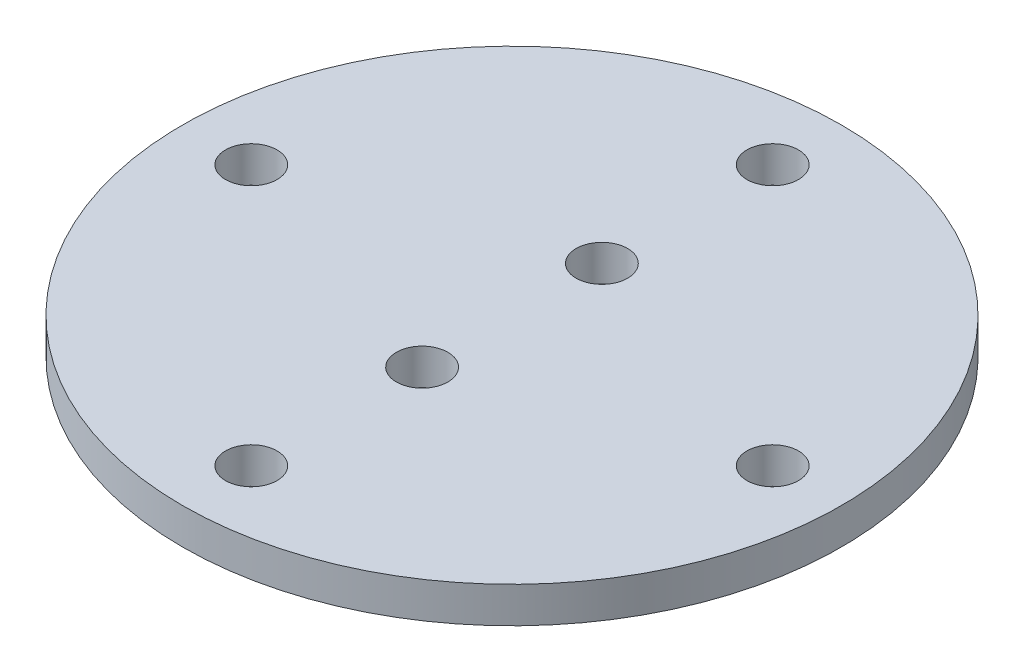
ISO-10303-21;
HEADER;
FILE_DESCRIPTION(('STEP AP214'),'2;1');
FILE_NAME('part.step','',(''),(''),'','','');
FILE_SCHEMA(('AUTOMOTIVE_DESIGN { 1 0 10303 214 1 1 1 1 }'));
ENDSEC;
DATA;
#1=APPLICATION_CONTEXT('core data for automotive mechanical design processes');
#2=APPLICATION_PROTOCOL_DEFINITION('international standard','automotive_design',2000,#1);
#3=PRODUCT_CONTEXT('',#1,'mechanical');
#4=PRODUCT('Part','Part','',(#3));
#5=PRODUCT_RELATED_PRODUCT_CATEGORY('part','',(#4));
#6=PRODUCT_DEFINITION_FORMATION('','',#4);
#7=PRODUCT_DEFINITION_CONTEXT('part definition',#1,'design');
#8=PRODUCT_DEFINITION('design','',#6,#7);
#9=PRODUCT_DEFINITION_SHAPE('','',#8);
#10=(LENGTH_UNIT() NAMED_UNIT(*) SI_UNIT(.MILLI.,.METRE.));
#11=(NAMED_UNIT(*) PLANE_ANGLE_UNIT() SI_UNIT($,.RADIAN.));
#12=(NAMED_UNIT(*) SI_UNIT($,.STERADIAN.) SOLID_ANGLE_UNIT());
#13=UNCERTAINTY_MEASURE_WITH_UNIT(LENGTH_MEASURE(1.E-05),#10,'distance_accuracy_value','');
#14=(GEOMETRIC_REPRESENTATION_CONTEXT(3) GLOBAL_UNCERTAINTY_ASSIGNED_CONTEXT((#13)) GLOBAL_UNIT_ASSIGNED_CONTEXT((#10,
#11,#12)) REPRESENTATION_CONTEXT('',''));
#15=CARTESIAN_POINT('',(0.,0.,0.));
#16=DIRECTION('',(0.,0.,1.));
#17=DIRECTION('',(1.,0.,0.));
#18=AXIS2_PLACEMENT_3D('',#15,#16,#17);
#19=CARTESIAN_POINT('',(0.,3.,0.));
#20=DIRECTION('',(0.,1.,0.));
#21=DIRECTION('',(0.,0.,1.));
#22=AXIS2_PLACEMENT_3D('',#19,#20,#21);
#23=PLANE('',#22);
#24=CARTESIAN_POINT('',(0.,3.,-7.5));
#25=DIRECTION('',(0.,1.,0.));
#26=DIRECTION('',(0.,0.,1.));
#27=AXIS2_PLACEMENT_3D('',#24,#25,#26);
#28=CIRCLE('',#27,2.15);
#29=CARTESIAN_POINT('',(0.,3.,-5.35));
#30=VERTEX_POINT('',#29);
#31=EDGE_CURVE('E73',#30,#30,#28,.T.);
#32=ORIENTED_EDGE('',*,*,#31,.F.);
#33=EDGE_LOOP('',(#32));
#34=FACE_BOUND('',#33,.T.);
#35=CARTESIAN_POINT('',(0.,3.,-21.7548503515756));
#36=DIRECTION('',(0.,1.,0.));
#37=DIRECTION('',(0.,0.,1.));
#38=AXIS2_PLACEMENT_3D('',#35,#36,#37);
#39=CIRCLE('',#38,2.15);
#40=CARTESIAN_POINT('',(0.,3.,-19.6048503515756));
#41=VERTEX_POINT('',#40);
#42=EDGE_CURVE('E61',#41,#41,#39,.T.);
#43=ORIENTED_EDGE('',*,*,#42,.F.);
#44=EDGE_LOOP('',(#43));
#45=FACE_BOUND('',#44,.T.);
#46=CARTESIAN_POINT('',(0.,3.,21.7548503515756));
#47=DIRECTION('',(0.,1.,0.));
#48=DIRECTION('',(0.,0.,1.));
#49=AXIS2_PLACEMENT_3D('',#46,#47,#48);
#50=CIRCLE('',#49,2.15);
#51=CARTESIAN_POINT('',(0.,3.,23.9048503515756));
#52=VERTEX_POINT('',#51);
#53=EDGE_CURVE('E50',#52,#52,#50,.T.);
#54=ORIENTED_EDGE('',*,*,#53,.F.);
#55=EDGE_LOOP('',(#54));
#56=FACE_BOUND('',#55,.T.);
#57=CARTESIAN_POINT('',(0.,3.,0.));
#58=DIRECTION('',(0.,1.,0.));
#59=DIRECTION('',(0.,0.,1.));
#60=AXIS2_PLACEMENT_3D('',#57,#58,#59);
#61=CIRCLE('',#60,27.5);
#62=CARTESIAN_POINT('',(0.,3.,27.5));
#63=VERTEX_POINT('',#62);
#64=EDGE_CURVE('E10',#63,#63,#61,.T.);
#65=ORIENTED_EDGE('',*,*,#64,.T.);
#66=EDGE_LOOP('',(#65));
#67=FACE_BOUND('',#66,.T.);
#68=CARTESIAN_POINT('',(21.7548503515756,3.,0.));
#69=DIRECTION('',(0.,1.,0.));
#70=DIRECTION('',(0.,0.,1.));
#71=AXIS2_PLACEMENT_3D('',#68,#69,#70);
#72=CIRCLE('',#71,2.15);
#73=CARTESIAN_POINT('',(21.7548503515756,3.,2.15));
#74=VERTEX_POINT('',#73);
#75=EDGE_CURVE('E55',#74,#74,#72,.T.);
#76=ORIENTED_EDGE('',*,*,#75,.F.);
#77=EDGE_LOOP('',(#76));
#78=FACE_BOUND('',#77,.T.);
#79=CARTESIAN_POINT('',(-21.7548503515756,3.,0.));
#80=DIRECTION('',(0.,1.,0.));
#81=DIRECTION('',(0.,0.,1.));
#82=AXIS2_PLACEMENT_3D('',#79,#80,#81);
#83=CIRCLE('',#82,2.15);
#84=CARTESIAN_POINT('',(-21.7548503515756,3.,2.15));
#85=VERTEX_POINT('',#84);
#86=EDGE_CURVE('E67',#85,#85,#83,.T.);
#87=ORIENTED_EDGE('',*,*,#86,.F.);
#88=EDGE_LOOP('',(#87));
#89=FACE_BOUND('',#88,.T.);
#90=CARTESIAN_POINT('',(0.,3.,7.5));
#91=DIRECTION('',(0.,1.,0.));
#92=DIRECTION('',(0.,0.,1.));
#93=AXIS2_PLACEMENT_3D('',#90,#91,#92);
#94=CIRCLE('',#93,2.15);
#95=CARTESIAN_POINT('',(0.,3.,9.65));
#96=VERTEX_POINT('',#95);
#97=EDGE_CURVE('E79',#96,#96,#94,.T.);
#98=ORIENTED_EDGE('',*,*,#97,.F.);
#99=EDGE_LOOP('',(#98));
#100=FACE_BOUND('',#99,.T.);
#101=ADVANCED_FACE('F39',(#34,#45,#56,#67,#78,#89,#100),#23,.T.);
#102=CARTESIAN_POINT('',(0.,0.,0.));
#103=DIRECTION('',(0.,1.,0.));
#104=DIRECTION('',(0.,0.,1.));
#105=AXIS2_PLACEMENT_3D('',#102,#103,#104);
#106=PLANE('',#105);
#107=CARTESIAN_POINT('',(0.,0.,0.));
#108=DIRECTION('',(0.,1.,0.));
#109=DIRECTION('',(0.,0.,1.));
#110=AXIS2_PLACEMENT_3D('',#107,#108,#109);
#111=CIRCLE('',#110,27.5);
#112=CARTESIAN_POINT('',(0.,0.,27.5));
#113=VERTEX_POINT('',#112);
#114=EDGE_CURVE('E43',#113,#113,#111,.T.);
#115=ORIENTED_EDGE('',*,*,#114,.F.);
#116=EDGE_LOOP('',(#115));
#117=FACE_BOUND('',#116,.T.);
#118=CARTESIAN_POINT('',(0.,0.,21.7548503515756));
#119=DIRECTION('',(0.,1.,0.));
#120=DIRECTION('',(0.,0.,1.));
#121=AXIS2_PLACEMENT_3D('',#118,#119,#120);
#122=CIRCLE('',#121,2.15);
#123=CARTESIAN_POINT('',(0.,0.,23.9048503515756));
#124=VERTEX_POINT('',#123);
#125=EDGE_CURVE('E52',#124,#124,#122,.T.);
#126=ORIENTED_EDGE('',*,*,#125,.T.);
#127=EDGE_LOOP('',(#126));
#128=FACE_BOUND('',#127,.T.);
#129=CARTESIAN_POINT('',(21.7548503515756,0.,0.));
#130=DIRECTION('',(0.,1.,0.));
#131=DIRECTION('',(0.,0.,1.));
#132=AXIS2_PLACEMENT_3D('',#129,#130,#131);
#133=CIRCLE('',#132,2.15);
#134=CARTESIAN_POINT('',(21.7548503515756,0.,2.15));
#135=VERTEX_POINT('',#134);
#136=EDGE_CURVE('E58',#135,#135,#133,.T.);
#137=ORIENTED_EDGE('',*,*,#136,.T.);
#138=EDGE_LOOP('',(#137));
#139=FACE_BOUND('',#138,.T.);
#140=CARTESIAN_POINT('',(0.,0.,-21.7548503515756));
#141=DIRECTION('',(0.,1.,0.));
#142=DIRECTION('',(0.,0.,1.));
#143=AXIS2_PLACEMENT_3D('',#140,#141,#142);
#144=CIRCLE('',#143,2.15);
#145=CARTESIAN_POINT('',(0.,0.,-19.6048503515756));
#146=VERTEX_POINT('',#145);
#147=EDGE_CURVE('E64',#146,#146,#144,.T.);
#148=ORIENTED_EDGE('',*,*,#147,.T.);
#149=EDGE_LOOP('',(#148));
#150=FACE_BOUND('',#149,.T.);
#151=CARTESIAN_POINT('',(-21.7548503515756,0.,0.));
#152=DIRECTION('',(0.,1.,0.));
#153=DIRECTION('',(0.,0.,1.));
#154=AXIS2_PLACEMENT_3D('',#151,#152,#153);
#155=CIRCLE('',#154,2.15);
#156=CARTESIAN_POINT('',(-21.7548503515756,0.,2.15));
#157=VERTEX_POINT('',#156);
#158=EDGE_CURVE('E70',#157,#157,#155,.T.);
#159=ORIENTED_EDGE('',*,*,#158,.T.);
#160=EDGE_LOOP('',(#159));
#161=FACE_BOUND('',#160,.T.);
#162=CARTESIAN_POINT('',(0.,0.,-7.5));
#163=DIRECTION('',(0.,1.,0.));
#164=DIRECTION('',(0.,0.,1.));
#165=AXIS2_PLACEMENT_3D('',#162,#163,#164);
#166=CIRCLE('',#165,2.15);
#167=CARTESIAN_POINT('',(0.,0.,-5.35));
#168=VERTEX_POINT('',#167);
#169=EDGE_CURVE('E76',#168,#168,#166,.T.);
#170=ORIENTED_EDGE('',*,*,#169,.T.);
#171=EDGE_LOOP('',(#170));
#172=FACE_BOUND('',#171,.T.);
#173=CARTESIAN_POINT('',(0.,0.,7.5));
#174=DIRECTION('',(0.,1.,0.));
#175=DIRECTION('',(0.,0.,1.));
#176=AXIS2_PLACEMENT_3D('',#173,#174,#175);
#177=CIRCLE('',#176,2.15);
#178=CARTESIAN_POINT('',(0.,0.,9.65));
#179=VERTEX_POINT('',#178);
#180=EDGE_CURVE('E82',#179,#179,#177,.T.);
#181=ORIENTED_EDGE('',*,*,#180,.T.);
#182=EDGE_LOOP('',(#181));
#183=FACE_BOUND('',#182,.T.);
#184=ADVANCED_FACE('F92',(#117,#128,#139,#150,#161,#172,#183),#106,.F.);
#185=CARTESIAN_POINT('',(0.,3.,0.));
#186=DIRECTION('',(0.,-1.,0.));
#187=DIRECTION('',(0.,0.,-1.));
#188=AXIS2_PLACEMENT_3D('',#185,#186,#187);
#189=CYLINDRICAL_SURFACE('',#188,27.5);
#190=ORIENTED_EDGE('',*,*,#64,.F.);
#191=EDGE_LOOP('',(#190));
#192=FACE_BOUND('',#191,.T.);
#193=ORIENTED_EDGE('',*,*,#114,.T.);
#194=EDGE_LOOP('',(#193));
#195=FACE_BOUND('',#194,.T.);
#196=ADVANCED_FACE('F41',(#192,#195),#189,.T.);
#197=CARTESIAN_POINT('',(0.,3.,21.7548503515756));
#198=DIRECTION('',(0.,-1.,0.));
#199=DIRECTION('',(0.,0.,-1.));
#200=AXIS2_PLACEMENT_3D('',#197,#198,#199);
#201=CYLINDRICAL_SURFACE('',#200,2.15);
#202=ORIENTED_EDGE('',*,*,#53,.T.);
#203=EDGE_LOOP('',(#202));
#204=FACE_BOUND('',#203,.T.);
#205=ORIENTED_EDGE('',*,*,#125,.F.);
#206=EDGE_LOOP('',(#205));
#207=FACE_BOUND('',#206,.T.);
#208=ADVANCED_FACE('F102',(#204,#207),#201,.F.);
#209=CARTESIAN_POINT('',(21.7548503515756,3.,0.));
#210=DIRECTION('',(0.,-1.,0.));
#211=DIRECTION('',(0.,0.,-1.));
#212=AXIS2_PLACEMENT_3D('',#209,#210,#211);
#213=CYLINDRICAL_SURFACE('',#212,2.15);
#214=ORIENTED_EDGE('',*,*,#75,.T.);
#215=EDGE_LOOP('',(#214));
#216=FACE_BOUND('',#215,.T.);
#217=ORIENTED_EDGE('',*,*,#136,.F.);
#218=EDGE_LOOP('',(#217));
#219=FACE_BOUND('',#218,.T.);
#220=ADVANCED_FACE('F105',(#216,#219),#213,.F.);
#221=CARTESIAN_POINT('',(0.,3.,-21.7548503515756));
#222=DIRECTION('',(0.,-1.,0.));
#223=DIRECTION('',(0.,0.,-1.));
#224=AXIS2_PLACEMENT_3D('',#221,#222,#223);
#225=CYLINDRICAL_SURFACE('',#224,2.15);
#226=ORIENTED_EDGE('',*,*,#42,.T.);
#227=EDGE_LOOP('',(#226));
#228=FACE_BOUND('',#227,.T.);
#229=ORIENTED_EDGE('',*,*,#147,.F.);
#230=EDGE_LOOP('',(#229));
#231=FACE_BOUND('',#230,.T.);
#232=ADVANCED_FACE('F109',(#228,#231),#225,.F.);
#233=CARTESIAN_POINT('',(-21.7548503515756,3.,0.));
#234=DIRECTION('',(0.,-1.,0.));
#235=DIRECTION('',(0.,0.,-1.));
#236=AXIS2_PLACEMENT_3D('',#233,#234,#235);
#237=CYLINDRICAL_SURFACE('',#236,2.15);
#238=ORIENTED_EDGE('',*,*,#86,.T.);
#239=EDGE_LOOP('',(#238));
#240=FACE_BOUND('',#239,.T.);
#241=ORIENTED_EDGE('',*,*,#158,.F.);
#242=EDGE_LOOP('',(#241));
#243=FACE_BOUND('',#242,.T.);
#244=ADVANCED_FACE('F113',(#240,#243),#237,.F.);
#245=CARTESIAN_POINT('',(0.,3.,-7.5));
#246=DIRECTION('',(0.,-1.,0.));
#247=DIRECTION('',(0.,0.,-1.));
#248=AXIS2_PLACEMENT_3D('',#245,#246,#247);
#249=CYLINDRICAL_SURFACE('',#248,2.15);
#250=ORIENTED_EDGE('',*,*,#31,.T.);
#251=EDGE_LOOP('',(#250));
#252=FACE_BOUND('',#251,.T.);
#253=ORIENTED_EDGE('',*,*,#169,.F.);
#254=EDGE_LOOP('',(#253));
#255=FACE_BOUND('',#254,.T.);
#256=ADVANCED_FACE('F117',(#252,#255),#249,.F.);
#257=CARTESIAN_POINT('',(0.,3.,7.5));
#258=DIRECTION('',(0.,-1.,0.));
#259=DIRECTION('',(0.,0.,-1.));
#260=AXIS2_PLACEMENT_3D('',#257,#258,#259);
#261=CYLINDRICAL_SURFACE('',#260,2.15);
#262=ORIENTED_EDGE('',*,*,#97,.T.);
#263=EDGE_LOOP('',(#262));
#264=FACE_BOUND('',#263,.T.);
#265=ORIENTED_EDGE('',*,*,#180,.F.);
#266=EDGE_LOOP('',(#265));
#267=FACE_BOUND('',#266,.T.);
#268=ADVANCED_FACE('F88',(#264,#267),#261,.F.);
#269=CLOSED_SHELL('',(#101,#184,#196,#208,#220,#232,#244,#256,#268));
#270=MANIFOLD_SOLID_BREP('B2',#269);
#271=ADVANCED_BREP_SHAPE_REPRESENTATION('',(#18,#270),#14);
#272=SHAPE_DEFINITION_REPRESENTATION(#9,#271);
ENDSEC;
END-ISO-10303-21;
